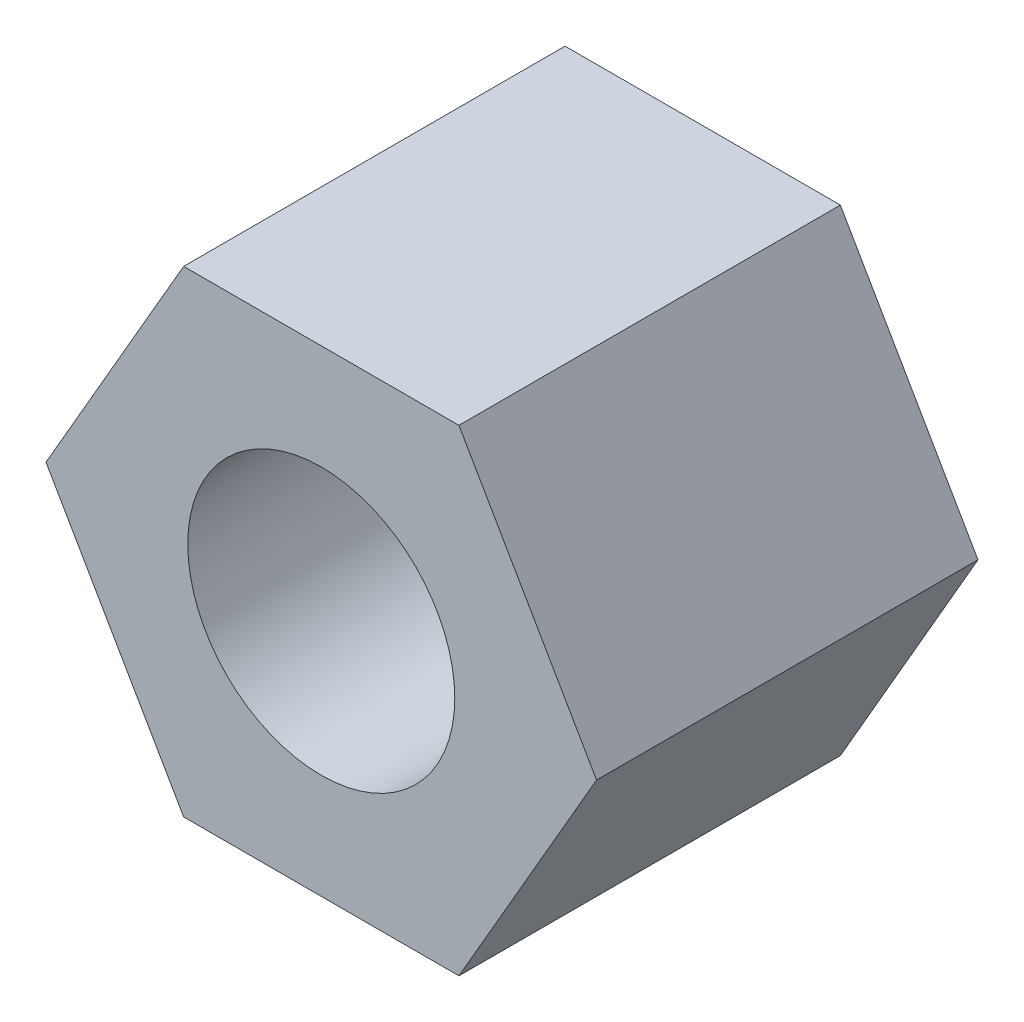
ISO-10303-21;
HEADER;
FILE_DESCRIPTION(('STEP AP214'),'2;1');
FILE_NAME('part.step','',(''),(''),'','','');
FILE_SCHEMA(('AUTOMOTIVE_DESIGN { 1 0 10303 214 1 1 1 1 }'));
ENDSEC;
DATA;
#1=APPLICATION_CONTEXT('core data for automotive mechanical design processes');
#2=APPLICATION_PROTOCOL_DEFINITION('international standard','automotive_design',2000,#1);
#3=PRODUCT_CONTEXT('',#1,'mechanical');
#4=PRODUCT('Part','Part','',(#3));
#5=PRODUCT_RELATED_PRODUCT_CATEGORY('part','',(#4));
#6=PRODUCT_DEFINITION_FORMATION('','',#4);
#7=PRODUCT_DEFINITION_CONTEXT('part definition',#1,'design');
#8=PRODUCT_DEFINITION('design','',#6,#7);
#9=PRODUCT_DEFINITION_SHAPE('','',#8);
#10=(LENGTH_UNIT() NAMED_UNIT(*) SI_UNIT(.MILLI.,.METRE.));
#11=(NAMED_UNIT(*) PLANE_ANGLE_UNIT() SI_UNIT($,.RADIAN.));
#12=(NAMED_UNIT(*) SI_UNIT($,.STERADIAN.) SOLID_ANGLE_UNIT());
#13=UNCERTAINTY_MEASURE_WITH_UNIT(LENGTH_MEASURE(1.E-05),#10,'distance_accuracy_value','');
#14=(GEOMETRIC_REPRESENTATION_CONTEXT(3) GLOBAL_UNCERTAINTY_ASSIGNED_CONTEXT((#13)) GLOBAL_UNIT_ASSIGNED_CONTEXT((#10,
#11,#12)) REPRESENTATION_CONTEXT('',''));
#15=CARTESIAN_POINT('',(0.,0.,0.));
#16=DIRECTION('',(0.,0.,1.));
#17=DIRECTION('',(1.,0.,0.));
#18=AXIS2_PLACEMENT_3D('',#15,#16,#17);
#19=CARTESIAN_POINT('',(0.,0.,4.));
#20=DIRECTION('',(0.,0.,1.));
#21=DIRECTION('',(1.,0.,0.));
#22=AXIS2_PLACEMENT_3D('',#19,#20,#21);
#23=PLANE('',#22);
#24=DIRECTION('',(0.5,0.866025403784439,0.));
#25=VECTOR('',#24,1.);
#26=CARTESIAN_POINT('',(1.44337567297406,-2.5,4.));
#27=LINE('',#26,#25);
#28=CARTESIAN_POINT('',(1.44337567297406,-2.5,4.));
#29=VERTEX_POINT('',#28);
#30=CARTESIAN_POINT('',(2.88675134594813,0.,4.));
#31=VERTEX_POINT('',#30);
#32=EDGE_CURVE('E129',#29,#31,#27,.T.);
#33=ORIENTED_EDGE('',*,*,#32,.T.);
#34=DIRECTION('',(-0.5,0.866025403784439,0.));
#35=VECTOR('',#34,1.);
#36=CARTESIAN_POINT('',(2.88675134594813,0.,4.));
#37=LINE('',#36,#35);
#38=CARTESIAN_POINT('',(1.44337567297406,2.5,4.));
#39=VERTEX_POINT('',#38);
#40=EDGE_CURVE('E87',#31,#39,#37,.T.);
#41=ORIENTED_EDGE('',*,*,#40,.T.);
#42=DIRECTION('',(-1.,0.,0.));
#43=VECTOR('',#42,1.);
#44=CARTESIAN_POINT('',(1.44337567297406,2.5,4.));
#45=LINE('',#44,#43);
#46=CARTESIAN_POINT('',(-1.44337567297406,2.5,4.));
#47=VERTEX_POINT('',#46);
#48=EDGE_CURVE('E100',#39,#47,#45,.T.);
#49=ORIENTED_EDGE('',*,*,#48,.T.);
#50=DIRECTION('',(-0.5,-0.866025403784439,0.));
#51=VECTOR('',#50,1.);
#52=CARTESIAN_POINT('',(-1.44337567297406,2.5,4.));
#53=LINE('',#52,#51);
#54=CARTESIAN_POINT('',(-2.88675134594813,0.,4.));
#55=VERTEX_POINT('',#54);
#56=EDGE_CURVE('E94',#47,#55,#53,.T.);
#57=ORIENTED_EDGE('',*,*,#56,.T.);
#58=DIRECTION('',(0.5,-0.866025403784438,0.));
#59=VECTOR('',#58,1.);
#60=CARTESIAN_POINT('',(-2.88675134594813,0.,4.));
#61=LINE('',#60,#59);
#62=CARTESIAN_POINT('',(-1.44337567297406,-2.5,4.));
#63=VERTEX_POINT('',#62);
#64=EDGE_CURVE('E98',#55,#63,#61,.T.);
#65=ORIENTED_EDGE('',*,*,#64,.T.);
#66=DIRECTION('',(1.,0.,0.));
#67=VECTOR('',#66,1.);
#68=CARTESIAN_POINT('',(-1.44337567297406,-2.5,4.));
#69=LINE('',#68,#67);
#70=EDGE_CURVE('E50',#63,#29,#69,.T.);
#71=ORIENTED_EDGE('',*,*,#70,.T.);
#72=EDGE_LOOP('',(#33,#41,#49,#57,#65,#71));
#73=FACE_BOUND('',#72,.T.);
#74=CARTESIAN_POINT('',(0.,0.,4.));
#75=DIRECTION('',(0.,0.,1.));
#76=DIRECTION('',(1.,0.,0.));
#77=AXIS2_PLACEMENT_3D('',#74,#75,#76);
#78=CIRCLE('',#77,1.4);
#79=CARTESIAN_POINT('',(1.4,0.,4.));
#80=VERTEX_POINT('',#79);
#81=EDGE_CURVE('E122',#80,#80,#78,.T.);
#82=ORIENTED_EDGE('',*,*,#81,.F.);
#83=EDGE_LOOP('',(#82));
#84=FACE_BOUND('',#83,.T.);
#85=ADVANCED_FACE('F33',(#73,#84),#23,.T.);
#86=CARTESIAN_POINT('',(0.,0.,0.));
#87=DIRECTION('',(0.,0.,1.));
#88=DIRECTION('',(1.,0.,0.));
#89=AXIS2_PLACEMENT_3D('',#86,#87,#88);
#90=PLANE('',#89);
#91=DIRECTION('',(0.5,0.866025403784439,0.));
#92=VECTOR('',#91,1.);
#93=CARTESIAN_POINT('',(1.44337567297406,-2.5,0.));
#94=LINE('',#93,#92);
#95=CARTESIAN_POINT('',(1.44337567297406,-2.5,0.));
#96=VERTEX_POINT('',#95);
#97=CARTESIAN_POINT('',(2.88675134594813,0.,0.));
#98=VERTEX_POINT('',#97);
#99=EDGE_CURVE('E118',#96,#98,#94,.T.);
#100=ORIENTED_EDGE('',*,*,#99,.F.);
#101=DIRECTION('',(1.,0.,0.));
#102=VECTOR('',#101,1.);
#103=CARTESIAN_POINT('',(-1.44337567297406,-2.5,0.));
#104=LINE('',#103,#102);
#105=CARTESIAN_POINT('',(-1.44337567297406,-2.5,0.));
#106=VERTEX_POINT('',#105);
#107=EDGE_CURVE('E79',#106,#96,#104,.T.);
#108=ORIENTED_EDGE('',*,*,#107,.F.);
#109=DIRECTION('',(0.5,-0.866025403784438,0.));
#110=VECTOR('',#109,1.);
#111=CARTESIAN_POINT('',(-2.88675134594813,0.,0.));
#112=LINE('',#111,#110);
#113=CARTESIAN_POINT('',(-2.88675134594813,0.,0.));
#114=VERTEX_POINT('',#113);
#115=EDGE_CURVE('E73',#114,#106,#112,.T.);
#116=ORIENTED_EDGE('',*,*,#115,.F.);
#117=DIRECTION('',(-0.5,-0.866025403784439,0.));
#118=VECTOR('',#117,1.);
#119=CARTESIAN_POINT('',(-1.44337567297406,2.5,0.));
#120=LINE('',#119,#118);
#121=CARTESIAN_POINT('',(-1.44337567297406,2.5,0.));
#122=VERTEX_POINT('',#121);
#123=EDGE_CURVE('E108',#122,#114,#120,.T.);
#124=ORIENTED_EDGE('',*,*,#123,.F.);
#125=DIRECTION('',(-1.,0.,0.));
#126=VECTOR('',#125,1.);
#127=CARTESIAN_POINT('',(1.44337567297406,2.5,0.));
#128=LINE('',#127,#126);
#129=CARTESIAN_POINT('',(1.44337567297406,2.5,0.));
#130=VERTEX_POINT('',#129);
#131=EDGE_CURVE('E124',#130,#122,#128,.T.);
#132=ORIENTED_EDGE('',*,*,#131,.F.);
#133=DIRECTION('',(-0.5,0.866025403784439,0.));
#134=VECTOR('',#133,1.);
#135=CARTESIAN_POINT('',(2.88675134594813,0.,0.));
#136=LINE('',#135,#134);
#137=EDGE_CURVE('E121',#98,#130,#136,.T.);
#138=ORIENTED_EDGE('',*,*,#137,.F.);
#139=EDGE_LOOP('',(#100,#108,#116,#124,#132,#138));
#140=FACE_BOUND('',#139,.T.);
#141=CARTESIAN_POINT('',(0.,0.,0.));
#142=DIRECTION('',(0.,0.,1.));
#143=DIRECTION('',(1.,0.,0.));
#144=AXIS2_PLACEMENT_3D('',#141,#142,#143);
#145=CIRCLE('',#144,1.4);
#146=CARTESIAN_POINT('',(1.4,0.,0.));
#147=VERTEX_POINT('',#146);
#148=EDGE_CURVE('E222',#147,#147,#145,.T.);
#149=ORIENTED_EDGE('',*,*,#148,.T.);
#150=EDGE_LOOP('',(#149));
#151=FACE_BOUND('',#150,.T.);
#152=ADVANCED_FACE('F138',(#140,#151),#90,.F.);
#153=CARTESIAN_POINT('',(1.44337567297406,-2.5,4.));
#154=DIRECTION('',(-0.866025403784439,0.5,0.));
#155=DIRECTION('',(-0.5,-0.866025403784439,0.));
#156=AXIS2_PLACEMENT_3D('',#153,#154,#155);
#157=PLANE('',#156);
#158=ORIENTED_EDGE('',*,*,#99,.T.);
#159=DIRECTION('',(0.,0.,-1.));
#160=VECTOR('',#159,1.);
#161=CARTESIAN_POINT('',(2.88675134594813,0.,4.));
#162=LINE('',#161,#160);
#163=EDGE_CURVE('E11',#31,#98,#162,.T.);
#164=ORIENTED_EDGE('',*,*,#163,.F.);
#165=ORIENTED_EDGE('',*,*,#32,.F.);
#166=DIRECTION('',(0.,0.,-1.));
#167=VECTOR('',#166,1.);
#168=CARTESIAN_POINT('',(1.44337567297406,-2.5,4.));
#169=LINE('',#168,#167);
#170=EDGE_CURVE('E114',#29,#96,#169,.T.);
#171=ORIENTED_EDGE('',*,*,#170,.T.);
#172=EDGE_LOOP('',(#158,#164,#165,#171));
#173=FACE_BOUND('',#172,.T.);
#174=ADVANCED_FACE('F35',(#173),#157,.F.);
#175=CARTESIAN_POINT('',(2.88675134594813,0.,4.));
#176=DIRECTION('',(-0.866025403784439,-0.5,0.));
#177=DIRECTION('',(0.5,-0.866025403784439,0.));
#178=AXIS2_PLACEMENT_3D('',#175,#176,#177);
#179=PLANE('',#178);
#180=ORIENTED_EDGE('',*,*,#137,.T.);
#181=DIRECTION('',(0.,0.,-1.));
#182=VECTOR('',#181,1.);
#183=CARTESIAN_POINT('',(1.44337567297406,2.5,4.));
#184=LINE('',#183,#182);
#185=EDGE_CURVE('E42',#39,#130,#184,.T.);
#186=ORIENTED_EDGE('',*,*,#185,.F.);
#187=ORIENTED_EDGE('',*,*,#40,.F.);
#188=ORIENTED_EDGE('',*,*,#163,.T.);
#189=EDGE_LOOP('',(#180,#186,#187,#188));
#190=FACE_BOUND('',#189,.T.);
#191=ADVANCED_FACE('F163',(#190),#179,.F.);
#192=CARTESIAN_POINT('',(1.44337567297406,2.5,4.));
#193=DIRECTION('',(0.,-1.,0.));
#194=DIRECTION('',(0.,0.,-1.));
#195=AXIS2_PLACEMENT_3D('',#192,#193,#194);
#196=PLANE('',#195);
#197=ORIENTED_EDGE('',*,*,#131,.T.);
#198=DIRECTION('',(0.,0.,-1.));
#199=VECTOR('',#198,1.);
#200=CARTESIAN_POINT('',(-1.44337567297406,2.5,4.));
#201=LINE('',#200,#199);
#202=EDGE_CURVE('E109',#47,#122,#201,.T.);
#203=ORIENTED_EDGE('',*,*,#202,.F.);
#204=ORIENTED_EDGE('',*,*,#48,.F.);
#205=ORIENTED_EDGE('',*,*,#185,.T.);
#206=EDGE_LOOP('',(#197,#203,#204,#205));
#207=FACE_BOUND('',#206,.T.);
#208=ADVANCED_FACE('F135',(#207),#196,.F.);
#209=CARTESIAN_POINT('',(-1.44337567297406,2.5,4.));
#210=DIRECTION('',(0.866025403784439,-0.5,0.));
#211=DIRECTION('',(0.5,0.866025403784439,0.));
#212=AXIS2_PLACEMENT_3D('',#209,#210,#211);
#213=PLANE('',#212);
#214=ORIENTED_EDGE('',*,*,#123,.T.);
#215=DIRECTION('',(0.,0.,-1.));
#216=VECTOR('',#215,1.);
#217=CARTESIAN_POINT('',(-2.88675134594813,0.,4.));
#218=LINE('',#217,#216);
#219=EDGE_CURVE('E105',#55,#114,#218,.T.);
#220=ORIENTED_EDGE('',*,*,#219,.F.);
#221=ORIENTED_EDGE('',*,*,#56,.F.);
#222=ORIENTED_EDGE('',*,*,#202,.T.);
#223=EDGE_LOOP('',(#214,#220,#221,#222));
#224=FACE_BOUND('',#223,.T.);
#225=ADVANCED_FACE('F106',(#224),#213,.F.);
#226=CARTESIAN_POINT('',(-2.88675134594813,0.,4.));
#227=DIRECTION('',(0.866025403784439,0.5,0.));
#228=DIRECTION('',(-0.5,0.866025403784439,0.));
#229=AXIS2_PLACEMENT_3D('',#226,#227,#228);
#230=PLANE('',#229);
#231=ORIENTED_EDGE('',*,*,#115,.T.);
#232=DIRECTION('',(0.,0.,-1.));
#233=VECTOR('',#232,1.);
#234=CARTESIAN_POINT('',(-1.44337567297406,-2.5,4.));
#235=LINE('',#234,#233);
#236=EDGE_CURVE('E110',#63,#106,#235,.T.);
#237=ORIENTED_EDGE('',*,*,#236,.F.);
#238=ORIENTED_EDGE('',*,*,#64,.F.);
#239=ORIENTED_EDGE('',*,*,#219,.T.);
#240=EDGE_LOOP('',(#231,#237,#238,#239));
#241=FACE_BOUND('',#240,.T.);
#242=ADVANCED_FACE('F112',(#241),#230,.F.);
#243=CARTESIAN_POINT('',(-1.44337567297406,-2.5,4.));
#244=DIRECTION('',(0.,1.,0.));
#245=DIRECTION('',(0.,0.,1.));
#246=AXIS2_PLACEMENT_3D('',#243,#244,#245);
#247=PLANE('',#246);
#248=ORIENTED_EDGE('',*,*,#107,.T.);
#249=ORIENTED_EDGE('',*,*,#170,.F.);
#250=ORIENTED_EDGE('',*,*,#70,.F.);
#251=ORIENTED_EDGE('',*,*,#236,.T.);
#252=EDGE_LOOP('',(#248,#249,#250,#251));
#253=FACE_BOUND('',#252,.T.);
#254=ADVANCED_FACE('F143',(#253),#247,.F.);
#255=CARTESIAN_POINT('',(0.,0.,4.));
#256=DIRECTION('',(0.,0.,-1.));
#257=DIRECTION('',(-1.,0.,0.));
#258=AXIS2_PLACEMENT_3D('',#255,#256,#257);
#259=CYLINDRICAL_SURFACE('',#258,1.4);
#260=ORIENTED_EDGE('',*,*,#81,.T.);
#261=EDGE_LOOP('',(#260));
#262=FACE_BOUND('',#261,.T.);
#263=ORIENTED_EDGE('',*,*,#148,.F.);
#264=EDGE_LOOP('',(#263));
#265=FACE_BOUND('',#264,.T.);
#266=ADVANCED_FACE('F145',(#262,#265),#259,.F.);
#267=CLOSED_SHELL('',(#85,#152,#174,#191,#208,#225,#242,#254,#266));
#268=MANIFOLD_SOLID_BREP('B2',#267);
#269=ADVANCED_BREP_SHAPE_REPRESENTATION('',(#18,#268),#14);
#270=SHAPE_DEFINITION_REPRESENTATION(#9,#269);
ENDSEC;
END-ISO-10303-21;
